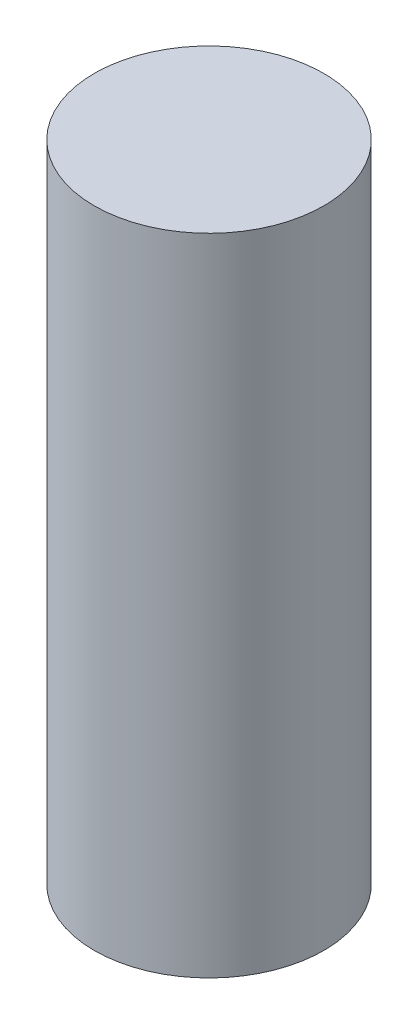
ISO-10303-21;
HEADER;
FILE_DESCRIPTION(('STEP AP214'),'2;1');
FILE_NAME('part.step','',(''),(''),'','','');
FILE_SCHEMA(('AUTOMOTIVE_DESIGN { 1 0 10303 214 1 1 1 1 }'));
ENDSEC;
DATA;
#1=APPLICATION_CONTEXT('core data for automotive mechanical design processes');
#2=APPLICATION_PROTOCOL_DEFINITION('international standard','automotive_design',2000,#1);
#3=PRODUCT_CONTEXT('',#1,'mechanical');
#4=PRODUCT('Part','Part','',(#3));
#5=PRODUCT_RELATED_PRODUCT_CATEGORY('part','',(#4));
#6=PRODUCT_DEFINITION_FORMATION('','',#4);
#7=PRODUCT_DEFINITION_CONTEXT('part definition',#1,'design');
#8=PRODUCT_DEFINITION('design','',#6,#7);
#9=PRODUCT_DEFINITION_SHAPE('','',#8);
#10=(LENGTH_UNIT() NAMED_UNIT(*) SI_UNIT(.MILLI.,.METRE.));
#11=(NAMED_UNIT(*) PLANE_ANGLE_UNIT() SI_UNIT($,.RADIAN.));
#12=(NAMED_UNIT(*) SI_UNIT($,.STERADIAN.) SOLID_ANGLE_UNIT());
#13=UNCERTAINTY_MEASURE_WITH_UNIT(LENGTH_MEASURE(1.E-05),#10,'distance_accuracy_value','');
#14=(GEOMETRIC_REPRESENTATION_CONTEXT(3) GLOBAL_UNCERTAINTY_ASSIGNED_CONTEXT((#13)) GLOBAL_UNIT_ASSIGNED_CONTEXT((#10,
#11,#12)) REPRESENTATION_CONTEXT('',''));
#15=CARTESIAN_POINT('',(0.,0.,0.));
#16=DIRECTION('',(0.,0.,1.));
#17=DIRECTION('',(1.,0.,0.));
#18=AXIS2_PLACEMENT_3D('',#15,#16,#17);
#19=CARTESIAN_POINT('',(0.,97.79,0.));
#20=DIRECTION('',(0.,-1.,0.));
#21=DIRECTION('',(0.,0.,-1.));
#22=AXIS2_PLACEMENT_3D('',#19,#20,#21);
#23=CYLINDRICAL_SURFACE('',#22,17.399);
#24=CARTESIAN_POINT('',(0.,97.79,0.));
#25=DIRECTION('',(0.,1.,0.));
#26=DIRECTION('',(0.,0.,1.));
#27=AXIS2_PLACEMENT_3D('',#24,#25,#26);
#28=CIRCLE('',#27,17.399);
#29=CARTESIAN_POINT('',(0.,97.79,17.399));
#30=VERTEX_POINT('',#29);
#31=EDGE_CURVE('E10',#30,#30,#28,.T.);
#32=ORIENTED_EDGE('',*,*,#31,.F.);
#33=EDGE_LOOP('',(#32));
#34=FACE_BOUND('',#33,.T.);
#35=CARTESIAN_POINT('',(0.,0.,0.));
#36=DIRECTION('',(0.,1.,0.));
#37=DIRECTION('',(0.,0.,1.));
#38=AXIS2_PLACEMENT_3D('',#35,#36,#37);
#39=CIRCLE('',#38,17.399);
#40=CARTESIAN_POINT('',(0.,0.,17.399));
#41=VERTEX_POINT('',#40);
#42=EDGE_CURVE('E34',#41,#41,#39,.T.);
#43=ORIENTED_EDGE('',*,*,#42,.T.);
#44=EDGE_LOOP('',(#43));
#45=FACE_BOUND('',#44,.T.);
#46=ADVANCED_FACE('F31',(#34,#45),#23,.T.);
#47=CARTESIAN_POINT('',(0.,97.79,0.));
#48=DIRECTION('',(0.,1.,0.));
#49=DIRECTION('',(0.,0.,1.));
#50=AXIS2_PLACEMENT_3D('',#47,#48,#49);
#51=PLANE('',#50);
#52=ORIENTED_EDGE('',*,*,#31,.T.);
#53=EDGE_LOOP('',(#52));
#54=FACE_BOUND('',#53,.T.);
#55=ADVANCED_FACE('F46',(#54),#51,.T.);
#56=CARTESIAN_POINT('',(0.,0.,0.));
#57=DIRECTION('',(0.,1.,0.));
#58=DIRECTION('',(0.,0.,1.));
#59=AXIS2_PLACEMENT_3D('',#56,#57,#58);
#60=PLANE('',#59);
#61=ORIENTED_EDGE('',*,*,#42,.F.);
#62=EDGE_LOOP('',(#61));
#63=FACE_BOUND('',#62,.T.);
#64=ADVANCED_FACE('F44',(#63),#60,.F.);
#65=CLOSED_SHELL('',(#46,#55,#64));
#66=MANIFOLD_SOLID_BREP('B2',#65);
#67=ADVANCED_BREP_SHAPE_REPRESENTATION('',(#18,#66),#14);
#68=SHAPE_DEFINITION_REPRESENTATION(#9,#67);
ENDSEC;
END-ISO-10303-21;
